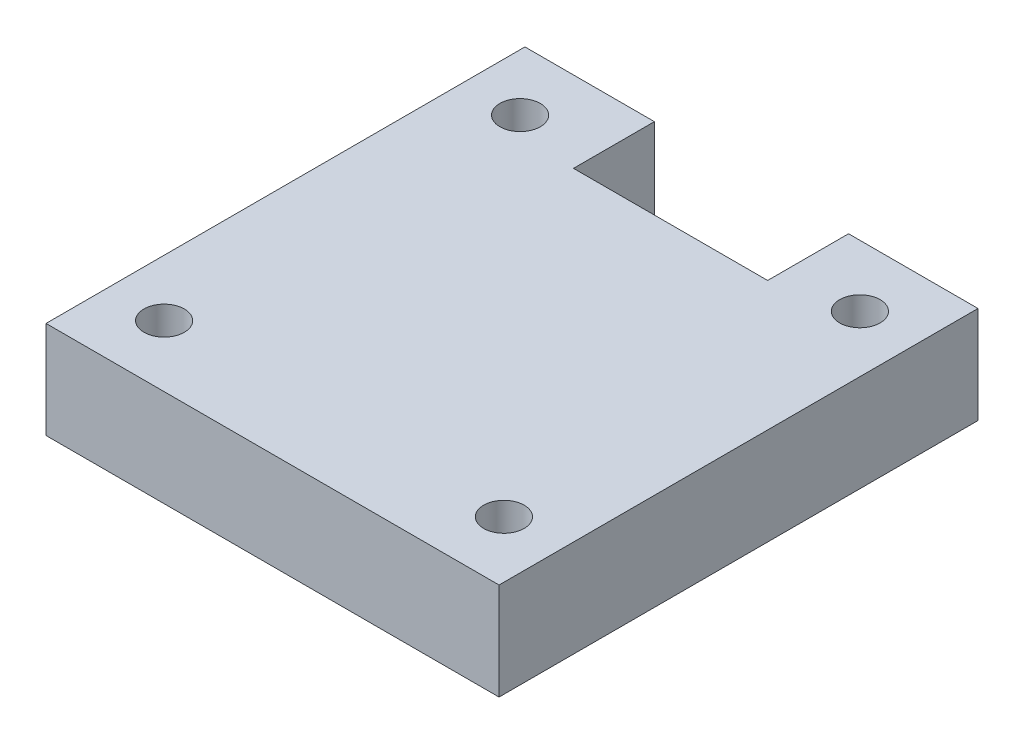
ISO-10303-21;
HEADER;
FILE_DESCRIPTION(('STEP AP214'),'2;1');
FILE_NAME('part.step','',(''),(''),'','','');
FILE_SCHEMA(('AUTOMOTIVE_DESIGN { 1 0 10303 214 1 1 1 1 }'));
ENDSEC;
DATA;
#1=APPLICATION_CONTEXT('core data for automotive mechanical design processes');
#2=APPLICATION_PROTOCOL_DEFINITION('international standard','automotive_design',2000,#1);
#3=PRODUCT_CONTEXT('',#1,'mechanical');
#4=PRODUCT('Part','Part','',(#3));
#5=PRODUCT_RELATED_PRODUCT_CATEGORY('part','',(#4));
#6=PRODUCT_DEFINITION_FORMATION('','',#4);
#7=PRODUCT_DEFINITION_CONTEXT('part definition',#1,'design');
#8=PRODUCT_DEFINITION('design','',#6,#7);
#9=PRODUCT_DEFINITION_SHAPE('','',#8);
#10=(LENGTH_UNIT() NAMED_UNIT(*) SI_UNIT(.MILLI.,.METRE.));
#11=(NAMED_UNIT(*) PLANE_ANGLE_UNIT() SI_UNIT($,.RADIAN.));
#12=(NAMED_UNIT(*) SI_UNIT($,.STERADIAN.) SOLID_ANGLE_UNIT());
#13=UNCERTAINTY_MEASURE_WITH_UNIT(LENGTH_MEASURE(1.E-05),#10,'distance_accuracy_value','');
#14=(GEOMETRIC_REPRESENTATION_CONTEXT(3) GLOBAL_UNCERTAINTY_ASSIGNED_CONTEXT((#13)) GLOBAL_UNIT_ASSIGNED_CONTEXT((#10,
#11,#12)) REPRESENTATION_CONTEXT('',''));
#15=CARTESIAN_POINT('',(0.,0.,0.));
#16=DIRECTION('',(0.,0.,1.));
#17=DIRECTION('',(1.,0.,0.));
#18=AXIS2_PLACEMENT_3D('',#15,#16,#17);
#19=CARTESIAN_POINT('',(0.500000000000004,52.7450610503899,-29.8));
#20=DIRECTION('',(0.,0.,1.));
#21=DIRECTION('',(1.,0.,0.));
#22=AXIS2_PLACEMENT_3D('',#19,#20,#21);
#23=PLANE('',#22);
#24=DIRECTION('',(-1.,0.,0.));
#25=VECTOR('',#24,1.);
#26=CARTESIAN_POINT('',(0.500000000000004,12.,-29.8));
#27=LINE('',#26,#25);
#28=CARTESIAN_POINT('',(8.50000000000001,12.,-29.8));
#29=VERTEX_POINT('',#28);
#30=CARTESIAN_POINT('',(0.500000000000004,12.,-29.8));
#31=VERTEX_POINT('',#30);
#32=EDGE_CURVE('E170',#29,#31,#27,.T.);
#33=ORIENTED_EDGE('',*,*,#32,.F.);
#34=DIRECTION('',(0.,1.,0.));
#35=VECTOR('',#34,1.);
#36=CARTESIAN_POINT('',(8.50000000000001,6.,-29.8));
#37=LINE('',#36,#35);
#38=CARTESIAN_POINT('',(8.50000000000001,6.,-29.8));
#39=VERTEX_POINT('',#38);
#40=EDGE_CURVE('E149',#39,#29,#37,.T.);
#41=ORIENTED_EDGE('',*,*,#40,.F.);
#42=DIRECTION('',(-1.,0.,0.));
#43=VECTOR('',#42,1.);
#44=CARTESIAN_POINT('',(0.500000000000004,6.,-29.8));
#45=LINE('',#44,#43);
#46=CARTESIAN_POINT('',(0.500000000000004,6.,-29.8));
#47=VERTEX_POINT('',#46);
#48=EDGE_CURVE('E133',#39,#47,#45,.T.);
#49=ORIENTED_EDGE('',*,*,#48,.T.);
#50=DIRECTION('',(0.,-1.,0.));
#51=VECTOR('',#50,1.);
#52=CARTESIAN_POINT('',(0.500000000000004,52.7450610503899,-29.8));
#53=LINE('',#52,#51);
#54=EDGE_CURVE('E218',#31,#47,#53,.T.);
#55=ORIENTED_EDGE('',*,*,#54,.F.);
#56=EDGE_LOOP('',(#33,#41,#49,#55));
#57=FACE_BOUND('',#56,.T.);
#58=ADVANCED_FACE('F45',(#57),#23,.F.);
#59=CARTESIAN_POINT('',(4.,52.7450610503899,-4.));
#60=DIRECTION('',(0.,-1.,0.));
#61=DIRECTION('',(0.,0.,-1.));
#62=AXIS2_PLACEMENT_3D('',#59,#60,#61);
#63=CYLINDRICAL_SURFACE('',#62,1.25);
#64=CARTESIAN_POINT('',(4.,6.,-4.));
#65=DIRECTION('',(0.,1.,0.));
#66=DIRECTION('',(0.,0.,1.));
#67=AXIS2_PLACEMENT_3D('',#64,#65,#66);
#68=CIRCLE('',#67,1.25);
#69=CARTESIAN_POINT('',(4.,6.,-2.75));
#70=VERTEX_POINT('',#69);
#71=EDGE_CURVE('E191',#70,#70,#68,.T.);
#72=ORIENTED_EDGE('',*,*,#71,.F.);
#73=EDGE_LOOP('',(#72));
#74=FACE_BOUND('',#73,.T.);
#75=CARTESIAN_POINT('',(4.,12.,-4.));
#76=DIRECTION('',(0.,1.,0.));
#77=DIRECTION('',(0.,0.,1.));
#78=AXIS2_PLACEMENT_3D('',#75,#76,#77);
#79=CIRCLE('',#78,1.25);
#80=CARTESIAN_POINT('',(4.,12.,-2.75));
#81=VERTEX_POINT('',#80);
#82=EDGE_CURVE('E158',#81,#81,#79,.T.);
#83=ORIENTED_EDGE('',*,*,#82,.T.);
#84=EDGE_LOOP('',(#83));
#85=FACE_BOUND('',#84,.T.);
#86=ADVANCED_FACE('F266',(#74,#85),#63,.F.);
#87=CARTESIAN_POINT('',(25.,52.7450610503899,-26.));
#88=DIRECTION('',(0.,-1.,0.));
#89=DIRECTION('',(0.,0.,-1.));
#90=AXIS2_PLACEMENT_3D('',#87,#88,#89);
#91=CYLINDRICAL_SURFACE('',#90,1.25);
#92=CARTESIAN_POINT('',(25.,6.,-26.));
#93=DIRECTION('',(0.,1.,0.));
#94=DIRECTION('',(0.,0.,1.));
#95=AXIS2_PLACEMENT_3D('',#92,#93,#94);
#96=CIRCLE('',#95,1.25);
#97=CARTESIAN_POINT('',(25.,6.,-24.75));
#98=VERTEX_POINT('',#97);
#99=EDGE_CURVE('E195',#98,#98,#96,.T.);
#100=ORIENTED_EDGE('',*,*,#99,.F.);
#101=EDGE_LOOP('',(#100));
#102=FACE_BOUND('',#101,.T.);
#103=CARTESIAN_POINT('',(25.,12.,-26.));
#104=DIRECTION('',(0.,1.,0.));
#105=DIRECTION('',(0.,0.,1.));
#106=AXIS2_PLACEMENT_3D('',#103,#104,#105);
#107=CIRCLE('',#106,1.25);
#108=CARTESIAN_POINT('',(25.,12.,-24.75));
#109=VERTEX_POINT('',#108);
#110=EDGE_CURVE('E162',#109,#109,#107,.T.);
#111=ORIENTED_EDGE('',*,*,#110,.T.);
#112=EDGE_LOOP('',(#111));
#113=FACE_BOUND('',#112,.T.);
#114=ADVANCED_FACE('F259',(#102,#113),#91,.F.);
#115=CARTESIAN_POINT('',(4.,52.7450610503899,-26.));
#116=DIRECTION('',(0.,-1.,0.));
#117=DIRECTION('',(0.,0.,-1.));
#118=AXIS2_PLACEMENT_3D('',#115,#116,#117);
#119=CYLINDRICAL_SURFACE('',#118,1.25);
#120=CARTESIAN_POINT('',(4.,6.,-26.));
#121=DIRECTION('',(0.,1.,0.));
#122=DIRECTION('',(0.,0.,1.));
#123=AXIS2_PLACEMENT_3D('',#120,#121,#122);
#124=CIRCLE('',#123,1.25);
#125=CARTESIAN_POINT('',(4.,6.,-24.75));
#126=VERTEX_POINT('',#125);
#127=EDGE_CURVE('E199',#126,#126,#124,.T.);
#128=ORIENTED_EDGE('',*,*,#127,.F.);
#129=EDGE_LOOP('',(#128));
#130=FACE_BOUND('',#129,.T.);
#131=CARTESIAN_POINT('',(4.,12.,-26.));
#132=DIRECTION('',(0.,1.,0.));
#133=DIRECTION('',(0.,0.,1.));
#134=AXIS2_PLACEMENT_3D('',#131,#132,#133);
#135=CIRCLE('',#134,1.25);
#136=CARTESIAN_POINT('',(4.,12.,-24.75));
#137=VERTEX_POINT('',#136);
#138=EDGE_CURVE('E166',#137,#137,#135,.T.);
#139=ORIENTED_EDGE('',*,*,#138,.T.);
#140=EDGE_LOOP('',(#139));
#141=FACE_BOUND('',#140,.T.);
#142=ADVANCED_FACE('F257',(#130,#141),#119,.F.);
#143=CARTESIAN_POINT('',(28.5,6.,-29.8));
#144=VERTEX_POINT('',#143);
#145=CARTESIAN_POINT('',(20.5,6.,-29.8));
#146=VERTEX_POINT('',#145);
#147=EDGE_CURVE('E214',#144,#146,#45,.T.);
#148=ORIENTED_EDGE('',*,*,#147,.T.);
#149=DIRECTION('',(0.,1.,0.));
#150=VECTOR('',#149,1.);
#151=CARTESIAN_POINT('',(20.5,6.,-29.8));
#152=LINE('',#151,#150);
#153=CARTESIAN_POINT('',(20.5,12.,-29.8));
#154=VERTEX_POINT('',#153);
#155=EDGE_CURVE('E152',#146,#154,#152,.T.);
#156=ORIENTED_EDGE('',*,*,#155,.T.);
#157=CARTESIAN_POINT('',(28.5,12.,-29.8));
#158=VERTEX_POINT('',#157);
#159=EDGE_CURVE('E171',#158,#154,#27,.T.);
#160=ORIENTED_EDGE('',*,*,#159,.F.);
#161=DIRECTION('',(0.,-1.,0.));
#162=VECTOR('',#161,1.);
#163=CARTESIAN_POINT('',(28.5,52.7450610503899,-29.8));
#164=LINE('',#163,#162);
#165=EDGE_CURVE('E70',#158,#144,#164,.T.);
#166=ORIENTED_EDGE('',*,*,#165,.T.);
#167=EDGE_LOOP('',(#148,#156,#160,#166));
#168=FACE_BOUND('',#167,.T.);
#169=ADVANCED_FACE('F233',(#168),#23,.F.);
#170=CARTESIAN_POINT('',(28.5,52.7450610503899,-29.8));
#171=DIRECTION('',(-1.,0.,0.));
#172=DIRECTION('',(0.,0.,1.));
#173=AXIS2_PLACEMENT_3D('',#170,#171,#172);
#174=PLANE('',#173);
#175=DIRECTION('',(0.,0.,-1.));
#176=VECTOR('',#175,1.);
#177=CARTESIAN_POINT('',(28.5,12.,-29.8));
#178=LINE('',#177,#176);
#179=CARTESIAN_POINT('',(28.5,12.,-0.200000000000002));
#180=VERTEX_POINT('',#179);
#181=EDGE_CURVE('E175',#180,#158,#178,.T.);
#182=ORIENTED_EDGE('',*,*,#181,.F.);
#183=DIRECTION('',(0.,-1.,0.));
#184=VECTOR('',#183,1.);
#185=CARTESIAN_POINT('',(28.5,52.7450610503899,-0.200000000000002));
#186=LINE('',#185,#184);
#187=CARTESIAN_POINT('',(28.5,6.,-0.200000000000002));
#188=VERTEX_POINT('',#187);
#189=EDGE_CURVE('E55',#180,#188,#186,.T.);
#190=ORIENTED_EDGE('',*,*,#189,.T.);
#191=DIRECTION('',(0.,0.,-1.));
#192=VECTOR('',#191,1.);
#193=CARTESIAN_POINT('',(28.5,6.,-29.8));
#194=LINE('',#193,#192);
#195=EDGE_CURVE('E211',#188,#144,#194,.T.);
#196=ORIENTED_EDGE('',*,*,#195,.T.);
#197=ORIENTED_EDGE('',*,*,#165,.F.);
#198=EDGE_LOOP('',(#182,#190,#196,#197));
#199=FACE_BOUND('',#198,.T.);
#200=ADVANCED_FACE('F225',(#199),#174,.F.);
#201=CARTESIAN_POINT('',(0.500000000000007,52.7450610503899,-0.199999999999999));
#202=DIRECTION('',(0.,0.,-1.));
#203=DIRECTION('',(-1.,0.,0.));
#204=AXIS2_PLACEMENT_3D('',#201,#202,#203);
#205=PLANE('',#204);
#206=DIRECTION('',(1.,0.,0.));
#207=VECTOR('',#206,1.);
#208=CARTESIAN_POINT('',(0.500000000000007,12.,-0.199999999999999));
#209=LINE('',#208,#207);
#210=CARTESIAN_POINT('',(0.500000000000007,12.,-0.199999999999999));
#211=VERTEX_POINT('',#210);
#212=EDGE_CURVE('E179',#211,#180,#209,.T.);
#213=ORIENTED_EDGE('',*,*,#212,.F.);
#214=DIRECTION('',(0.,-1.,0.));
#215=VECTOR('',#214,1.);
#216=CARTESIAN_POINT('',(0.500000000000007,52.7450610503899,-0.199999999999999));
#217=LINE('',#216,#215);
#218=CARTESIAN_POINT('',(0.500000000000007,6.,-0.199999999999999));
#219=VERTEX_POINT('',#218);
#220=EDGE_CURVE('E11',#211,#219,#217,.T.);
#221=ORIENTED_EDGE('',*,*,#220,.T.);
#222=DIRECTION('',(1.,0.,0.));
#223=VECTOR('',#222,1.);
#224=CARTESIAN_POINT('',(0.500000000000007,6.,-0.199999999999999));
#225=LINE('',#224,#223);
#226=EDGE_CURVE('E207',#219,#188,#225,.T.);
#227=ORIENTED_EDGE('',*,*,#226,.T.);
#228=ORIENTED_EDGE('',*,*,#189,.F.);
#229=EDGE_LOOP('',(#213,#221,#227,#228));
#230=FACE_BOUND('',#229,.T.);
#231=ADVANCED_FACE('F230',(#230),#205,.F.);
#232=CARTESIAN_POINT('',(0.500000000000004,52.7450610503899,-29.8));
#233=DIRECTION('',(1.,0.,0.));
#234=DIRECTION('',(0.,0.,-1.));
#235=AXIS2_PLACEMENT_3D('',#232,#233,#234);
#236=PLANE('',#235);
#237=DIRECTION('',(0.,0.,1.));
#238=VECTOR('',#237,1.);
#239=CARTESIAN_POINT('',(0.500000000000004,12.,-29.8));
#240=LINE('',#239,#238);
#241=EDGE_CURVE('E183',#31,#211,#240,.T.);
#242=ORIENTED_EDGE('',*,*,#241,.F.);
#243=ORIENTED_EDGE('',*,*,#54,.T.);
#244=DIRECTION('',(0.,0.,1.));
#245=VECTOR('',#244,1.);
#246=CARTESIAN_POINT('',(0.500000000000004,6.,-29.8));
#247=LINE('',#246,#245);
#248=EDGE_CURVE('E203',#47,#219,#247,.T.);
#249=ORIENTED_EDGE('',*,*,#248,.T.);
#250=ORIENTED_EDGE('',*,*,#220,.F.);
#251=EDGE_LOOP('',(#242,#243,#249,#250));
#252=FACE_BOUND('',#251,.T.);
#253=ADVANCED_FACE('F47',(#252),#236,.F.);
#254=CARTESIAN_POINT('',(0.,6.,0.));
#255=DIRECTION('',(0.,1.,0.));
#256=DIRECTION('',(0.,0.,1.));
#257=AXIS2_PLACEMENT_3D('',#254,#255,#256);
#258=PLANE('',#257);
#259=ORIENTED_EDGE('',*,*,#48,.F.);
#260=DIRECTION('',(0.,0.,1.));
#261=VECTOR('',#260,1.);
#262=CARTESIAN_POINT('',(8.50000000000001,6.,-29.8));
#263=LINE('',#262,#261);
#264=CARTESIAN_POINT('',(8.5,6.,-24.8));
#265=VERTEX_POINT('',#264);
#266=EDGE_CURVE('E112',#39,#265,#263,.T.);
#267=ORIENTED_EDGE('',*,*,#266,.T.);
#268=DIRECTION('',(1.,0.,0.));
#269=VECTOR('',#268,1.);
#270=CARTESIAN_POINT('',(8.5,6.,-24.8));
#271=LINE('',#270,#269);
#272=CARTESIAN_POINT('',(20.5,6.,-24.8));
#273=VERTEX_POINT('',#272);
#274=EDGE_CURVE('E122',#265,#273,#271,.T.);
#275=ORIENTED_EDGE('',*,*,#274,.T.);
#276=DIRECTION('',(0.,0.,-1.));
#277=VECTOR('',#276,1.);
#278=CARTESIAN_POINT('',(20.5,6.,-29.8));
#279=LINE('',#278,#277);
#280=EDGE_CURVE('E119',#273,#146,#279,.T.);
#281=ORIENTED_EDGE('',*,*,#280,.T.);
#282=ORIENTED_EDGE('',*,*,#147,.F.);
#283=ORIENTED_EDGE('',*,*,#195,.F.);
#284=ORIENTED_EDGE('',*,*,#226,.F.);
#285=ORIENTED_EDGE('',*,*,#248,.F.);
#286=EDGE_LOOP('',(#259,#267,#275,#281,#282,#283,#284,#285));
#287=FACE_BOUND('',#286,.T.);
#288=ORIENTED_EDGE('',*,*,#127,.T.);
#289=EDGE_LOOP('',(#288));
#290=FACE_BOUND('',#289,.T.);
#291=ORIENTED_EDGE('',*,*,#99,.T.);
#292=EDGE_LOOP('',(#291));
#293=FACE_BOUND('',#292,.T.);
#294=ORIENTED_EDGE('',*,*,#71,.T.);
#295=EDGE_LOOP('',(#294));
#296=FACE_BOUND('',#295,.T.);
#297=CARTESIAN_POINT('',(25.,6.,-4.));
#298=DIRECTION('',(0.,1.,0.));
#299=DIRECTION('',(0.,0.,1.));
#300=AXIS2_PLACEMENT_3D('',#297,#298,#299);
#301=CIRCLE('',#300,1.25);
#302=CARTESIAN_POINT('',(25.,6.,-2.75));
#303=VERTEX_POINT('',#302);
#304=EDGE_CURVE('E187',#303,#303,#301,.T.);
#305=ORIENTED_EDGE('',*,*,#304,.T.);
#306=EDGE_LOOP('',(#305));
#307=FACE_BOUND('',#306,.T.);
#308=ADVANCED_FACE('F130',(#287,#290,#293,#296,#307),#258,.F.);
#309=CARTESIAN_POINT('',(25.,52.7450610503899,-4.));
#310=DIRECTION('',(0.,-1.,0.));
#311=DIRECTION('',(0.,0.,-1.));
#312=AXIS2_PLACEMENT_3D('',#309,#310,#311);
#313=CYLINDRICAL_SURFACE('',#312,1.25);
#314=ORIENTED_EDGE('',*,*,#304,.F.);
#315=EDGE_LOOP('',(#314));
#316=FACE_BOUND('',#315,.T.);
#317=CARTESIAN_POINT('',(25.,12.,-4.));
#318=DIRECTION('',(0.,1.,0.));
#319=DIRECTION('',(0.,0.,1.));
#320=AXIS2_PLACEMENT_3D('',#317,#318,#319);
#321=CIRCLE('',#320,1.25);
#322=CARTESIAN_POINT('',(25.,12.,-2.75));
#323=VERTEX_POINT('',#322);
#324=EDGE_CURVE('E49',#323,#323,#321,.T.);
#325=ORIENTED_EDGE('',*,*,#324,.T.);
#326=EDGE_LOOP('',(#325));
#327=FACE_BOUND('',#326,.T.);
#328=ADVANCED_FACE('F247',(#316,#327),#313,.F.);
#329=CARTESIAN_POINT('',(0.,12.,0.));
#330=DIRECTION('',(0.,1.,0.));
#331=DIRECTION('',(0.,0.,1.));
#332=AXIS2_PLACEMENT_3D('',#329,#330,#331);
#333=PLANE('',#332);
#334=DIRECTION('',(0.,0.,1.));
#335=VECTOR('',#334,1.);
#336=CARTESIAN_POINT('',(8.50000000000001,12.,-29.8));
#337=LINE('',#336,#335);
#338=CARTESIAN_POINT('',(8.5,12.,-24.8));
#339=VERTEX_POINT('',#338);
#340=EDGE_CURVE('E62',#29,#339,#337,.T.);
#341=ORIENTED_EDGE('',*,*,#340,.F.);
#342=ORIENTED_EDGE('',*,*,#32,.T.);
#343=ORIENTED_EDGE('',*,*,#241,.T.);
#344=ORIENTED_EDGE('',*,*,#212,.T.);
#345=ORIENTED_EDGE('',*,*,#181,.T.);
#346=ORIENTED_EDGE('',*,*,#159,.T.);
#347=DIRECTION('',(0.,0.,-1.));
#348=VECTOR('',#347,1.);
#349=CARTESIAN_POINT('',(20.5,12.,-29.8));
#350=LINE('',#349,#348);
#351=CARTESIAN_POINT('',(20.5,12.,-24.8));
#352=VERTEX_POINT('',#351);
#353=EDGE_CURVE('E135',#352,#154,#350,.T.);
#354=ORIENTED_EDGE('',*,*,#353,.F.);
#355=DIRECTION('',(1.,0.,0.));
#356=VECTOR('',#355,1.);
#357=CARTESIAN_POINT('',(8.5,12.,-24.8));
#358=LINE('',#357,#356);
#359=EDGE_CURVE('E140',#339,#352,#358,.T.);
#360=ORIENTED_EDGE('',*,*,#359,.F.);
#361=EDGE_LOOP('',(#341,#342,#343,#344,#345,#346,#354,#360));
#362=FACE_BOUND('',#361,.T.);
#363=ORIENTED_EDGE('',*,*,#324,.F.);
#364=EDGE_LOOP('',(#363));
#365=FACE_BOUND('',#364,.T.);
#366=ORIENTED_EDGE('',*,*,#82,.F.);
#367=EDGE_LOOP('',(#366));
#368=FACE_BOUND('',#367,.T.);
#369=ORIENTED_EDGE('',*,*,#110,.F.);
#370=EDGE_LOOP('',(#369));
#371=FACE_BOUND('',#370,.T.);
#372=ORIENTED_EDGE('',*,*,#138,.F.);
#373=EDGE_LOOP('',(#372));
#374=FACE_BOUND('',#373,.T.);
#375=ADVANCED_FACE('F236',(#362,#365,#368,#371,#374),#333,.T.);
#376=CARTESIAN_POINT('',(8.50000000000001,6.,-29.8));
#377=DIRECTION('',(-1.,0.,0.));
#378=DIRECTION('',(0.,0.,1.));
#379=AXIS2_PLACEMENT_3D('',#376,#377,#378);
#380=PLANE('',#379);
#381=ORIENTED_EDGE('',*,*,#340,.T.);
#382=DIRECTION('',(0.,1.,0.));
#383=VECTOR('',#382,1.);
#384=CARTESIAN_POINT('',(8.5,6.,-24.8));
#385=LINE('',#384,#383);
#386=EDGE_CURVE('E108',#265,#339,#385,.T.);
#387=ORIENTED_EDGE('',*,*,#386,.F.);
#388=ORIENTED_EDGE('',*,*,#266,.F.);
#389=ORIENTED_EDGE('',*,*,#40,.T.);
#390=EDGE_LOOP('',(#381,#387,#388,#389));
#391=FACE_BOUND('',#390,.T.);
#392=ADVANCED_FACE('F110',(#391),#380,.F.);
#393=CARTESIAN_POINT('',(20.5,6.,-29.8));
#394=DIRECTION('',(1.,0.,0.));
#395=DIRECTION('',(0.,0.,-1.));
#396=AXIS2_PLACEMENT_3D('',#393,#394,#395);
#397=PLANE('',#396);
#398=ORIENTED_EDGE('',*,*,#353,.T.);
#399=ORIENTED_EDGE('',*,*,#155,.F.);
#400=ORIENTED_EDGE('',*,*,#280,.F.);
#401=DIRECTION('',(0.,1.,0.));
#402=VECTOR('',#401,1.);
#403=CARTESIAN_POINT('',(20.5,6.,-24.8));
#404=LINE('',#403,#402);
#405=EDGE_CURVE('E118',#273,#352,#404,.T.);
#406=ORIENTED_EDGE('',*,*,#405,.T.);
#407=EDGE_LOOP('',(#398,#399,#400,#406));
#408=FACE_BOUND('',#407,.T.);
#409=ADVANCED_FACE('F292',(#408),#397,.F.);
#410=CARTESIAN_POINT('',(8.5,6.,-24.8));
#411=DIRECTION('',(0.,0.,1.));
#412=DIRECTION('',(1.,0.,0.));
#413=AXIS2_PLACEMENT_3D('',#410,#411,#412);
#414=PLANE('',#413);
#415=ORIENTED_EDGE('',*,*,#359,.T.);
#416=ORIENTED_EDGE('',*,*,#405,.F.);
#417=ORIENTED_EDGE('',*,*,#274,.F.);
#418=ORIENTED_EDGE('',*,*,#386,.T.);
#419=EDGE_LOOP('',(#415,#416,#417,#418));
#420=FACE_BOUND('',#419,.T.);
#421=ADVANCED_FACE('F123',(#420),#414,.F.);
#422=CLOSED_SHELL('',(#58,#86,#114,#142,#169,#200,#231,#253,#308,#328,#375,#392,#409,#421));
#423=MANIFOLD_SOLID_BREP('B2',#422);
#424=ADVANCED_BREP_SHAPE_REPRESENTATION('',(#18,#423),#14);
#425=SHAPE_DEFINITION_REPRESENTATION(#9,#424);
ENDSEC;
END-ISO-10303-21;
